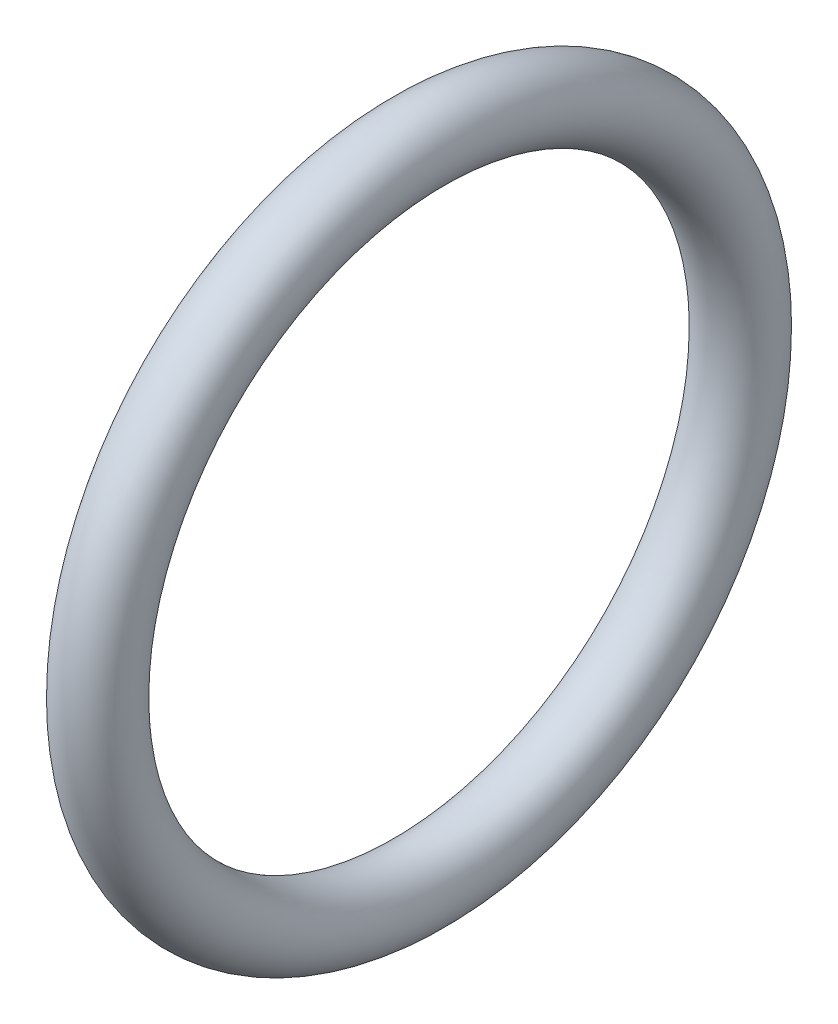
ISO-10303-21;
HEADER;
FILE_DESCRIPTION(('STEP AP214'),'2;1');
FILE_NAME('part.step','',(''),(''),'','','');
FILE_SCHEMA(('AUTOMOTIVE_DESIGN { 1 0 10303 214 1 1 1 1 }'));
ENDSEC;
DATA;
#1=APPLICATION_CONTEXT('core data for automotive mechanical design processes');
#2=APPLICATION_PROTOCOL_DEFINITION('international standard','automotive_design',2000,#1);
#3=PRODUCT_CONTEXT('',#1,'mechanical');
#4=PRODUCT('Part','Part','',(#3));
#5=PRODUCT_RELATED_PRODUCT_CATEGORY('part','',(#4));
#6=PRODUCT_DEFINITION_FORMATION('','',#4);
#7=PRODUCT_DEFINITION_CONTEXT('part definition',#1,'design');
#8=PRODUCT_DEFINITION('design','',#6,#7);
#9=PRODUCT_DEFINITION_SHAPE('','',#8);
#10=(LENGTH_UNIT() NAMED_UNIT(*) SI_UNIT(.MILLI.,.METRE.));
#11=(NAMED_UNIT(*) PLANE_ANGLE_UNIT() SI_UNIT($,.RADIAN.));
#12=(NAMED_UNIT(*) SI_UNIT($,.STERADIAN.) SOLID_ANGLE_UNIT());
#13=UNCERTAINTY_MEASURE_WITH_UNIT(LENGTH_MEASURE(1.E-05),#10,'distance_accuracy_value','');
#14=(GEOMETRIC_REPRESENTATION_CONTEXT(3) GLOBAL_UNCERTAINTY_ASSIGNED_CONTEXT((#13)) GLOBAL_UNIT_ASSIGNED_CONTEXT((#10,
#11,#12)) REPRESENTATION_CONTEXT('',''));
#15=CARTESIAN_POINT('',(0.,0.,0.));
#16=DIRECTION('',(0.,0.,1.));
#17=DIRECTION('',(1.,0.,0.));
#18=AXIS2_PLACEMENT_3D('',#15,#16,#17);
#19=CARTESIAN_POINT('',(0.,0.,0.));
#20=DIRECTION('',(-0.999999999999996,0.,0.));
#21=DIRECTION('',(0.,0.,1.));
#22=AXIS2_PLACEMENT_3D('',#19,#20,#21);
#23=TOROIDAL_SURFACE('',#22,11.1,1.25);
#24=CARTESIAN_POINT('',(0.,0.,12.35));
#25=VERTEX_POINT('',#24);
#26=VERTEX_LOOP('',#25);
#27=FACE_BOUND('',#26,.T.);
#28=ADVANCED_FACE('F12',(#27),#23,.T.);
#29=CLOSED_SHELL('',(#28));
#30=MANIFOLD_SOLID_BREP('B1',#29);
#31=ADVANCED_BREP_SHAPE_REPRESENTATION('',(#18,#30),#14);
#32=SHAPE_DEFINITION_REPRESENTATION(#9,#31);
ENDSEC;
END-ISO-10303-21;
